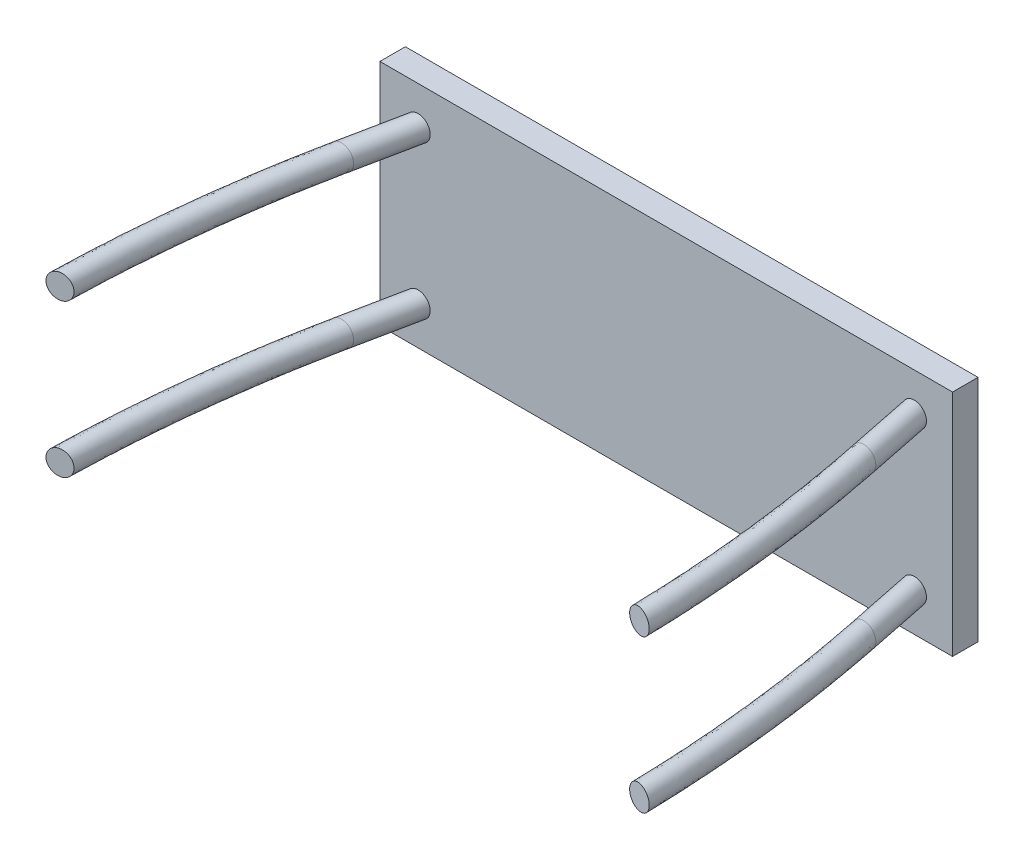
ISO-10303-21;
HEADER;
FILE_DESCRIPTION(('STEP AP214'),'2;1');
FILE_NAME('part.step','',(''),(''),'','','');
FILE_SCHEMA(('AUTOMOTIVE_DESIGN { 1 0 10303 214 1 1 1 1 }'));
ENDSEC;
DATA;
#1=APPLICATION_CONTEXT('core data for automotive mechanical design processes');
#2=APPLICATION_PROTOCOL_DEFINITION('international standard','automotive_design',2000,#1);
#3=PRODUCT_CONTEXT('',#1,'mechanical');
#4=PRODUCT('Part','Part','',(#3));
#5=PRODUCT_RELATED_PRODUCT_CATEGORY('part','',(#4));
#6=PRODUCT_DEFINITION_FORMATION('','',#4);
#7=PRODUCT_DEFINITION_CONTEXT('part definition',#1,'design');
#8=PRODUCT_DEFINITION('design','',#6,#7);
#9=PRODUCT_DEFINITION_SHAPE('','',#8);
#10=(LENGTH_UNIT() NAMED_UNIT(*) SI_UNIT(.MILLI.,.METRE.));
#11=(NAMED_UNIT(*) PLANE_ANGLE_UNIT() SI_UNIT($,.RADIAN.));
#12=(NAMED_UNIT(*) SI_UNIT($,.STERADIAN.) SOLID_ANGLE_UNIT());
#13=UNCERTAINTY_MEASURE_WITH_UNIT(LENGTH_MEASURE(1.E-05),#10,'distance_accuracy_value','');
#14=(GEOMETRIC_REPRESENTATION_CONTEXT(3) GLOBAL_UNCERTAINTY_ASSIGNED_CONTEXT((#13)) GLOBAL_UNIT_ASSIGNED_CONTEXT((#10,
#11,#12)) REPRESENTATION_CONTEXT('',''));
#15=CARTESIAN_POINT('',(0.,0.,0.));
#16=DIRECTION('',(0.,0.,1.));
#17=DIRECTION('',(1.,0.,0.));
#18=AXIS2_PLACEMENT_3D('',#15,#16,#17);
#19=CARTESIAN_POINT('',(0.,0.,50.8));
#20=DIRECTION('',(1.,0.,0.));
#21=DIRECTION('',(0.,0.,-1.));
#22=AXIS2_PLACEMENT_3D('',#19,#20,#21);
#23=PLANE('',#22);
#24=DIRECTION('',(0.,-1.,0.));
#25=VECTOR('',#24,1.);
#26=CARTESIAN_POINT('',(0.,0.,0.));
#27=LINE('',#26,#25);
#28=CARTESIAN_POINT('',(0.,457.2,0.));
#29=VERTEX_POINT('',#28);
#30=CARTESIAN_POINT('',(0.,0.,0.));
#31=VERTEX_POINT('',#30);
#32=EDGE_CURVE('E128',#29,#31,#27,.T.);
#33=ORIENTED_EDGE('',*,*,#32,.T.);
#34=DIRECTION('',(0.,0.,-1.));
#35=VECTOR('',#34,1.);
#36=CARTESIAN_POINT('',(0.,0.,50.8));
#37=LINE('',#36,#35);
#38=CARTESIAN_POINT('',(0.,0.,50.8));
#39=VERTEX_POINT('',#38);
#40=EDGE_CURVE('E11',#39,#31,#37,.T.);
#41=ORIENTED_EDGE('',*,*,#40,.F.);
#42=DIRECTION('',(0.,-1.,0.));
#43=VECTOR('',#42,1.);
#44=CARTESIAN_POINT('',(0.,0.,50.8));
#45=LINE('',#44,#43);
#46=CARTESIAN_POINT('',(0.,457.2,50.8));
#47=VERTEX_POINT('',#46);
#48=EDGE_CURVE('E129',#47,#39,#45,.T.);
#49=ORIENTED_EDGE('',*,*,#48,.F.);
#50=DIRECTION('',(0.,0.,-1.));
#51=VECTOR('',#50,1.);
#52=CARTESIAN_POINT('',(0.,457.2,50.8));
#53=LINE('',#52,#51);
#54=EDGE_CURVE('E135',#47,#29,#53,.T.);
#55=ORIENTED_EDGE('',*,*,#54,.T.);
#56=EDGE_LOOP('',(#33,#41,#49,#55));
#57=FACE_BOUND('',#56,.T.);
#58=ADVANCED_FACE('F33',(#57),#23,.F.);
#59=CARTESIAN_POINT('',(0.,0.,50.8));
#60=DIRECTION('',(0.,1.,0.));
#61=DIRECTION('',(0.,0.,1.));
#62=AXIS2_PLACEMENT_3D('',#59,#60,#61);
#63=PLANE('',#62);
#64=DIRECTION('',(1.,0.,0.));
#65=VECTOR('',#64,1.);
#66=CARTESIAN_POINT('',(0.,0.,0.));
#67=LINE('',#66,#65);
#68=CARTESIAN_POINT('',(1143.,0.,0.));
#69=VERTEX_POINT('',#68);
#70=EDGE_CURVE('E138',#31,#69,#67,.T.);
#71=ORIENTED_EDGE('',*,*,#70,.T.);
#72=DIRECTION('',(0.,0.,-1.));
#73=VECTOR('',#72,1.);
#74=CARTESIAN_POINT('',(1143.,0.,50.8));
#75=LINE('',#74,#73);
#76=CARTESIAN_POINT('',(1143.,0.,50.8));
#77=VERTEX_POINT('',#76);
#78=EDGE_CURVE('E41',#77,#69,#75,.T.);
#79=ORIENTED_EDGE('',*,*,#78,.F.);
#80=DIRECTION('',(1.,0.,0.));
#81=VECTOR('',#80,1.);
#82=CARTESIAN_POINT('',(0.,0.,50.8));
#83=LINE('',#82,#81);
#84=EDGE_CURVE('E80',#39,#77,#83,.T.);
#85=ORIENTED_EDGE('',*,*,#84,.F.);
#86=ORIENTED_EDGE('',*,*,#40,.T.);
#87=EDGE_LOOP('',(#71,#79,#85,#86));
#88=FACE_BOUND('',#87,.T.);
#89=ADVANCED_FACE('F162',(#88),#63,.F.);
#90=CARTESIAN_POINT('',(1143.,0.,50.8));
#91=DIRECTION('',(-1.,0.,0.));
#92=DIRECTION('',(0.,0.,1.));
#93=AXIS2_PLACEMENT_3D('',#90,#91,#92);
#94=PLANE('',#93);
#95=DIRECTION('',(0.,1.,0.));
#96=VECTOR('',#95,1.);
#97=CARTESIAN_POINT('',(1143.,0.,0.));
#98=LINE('',#97,#96);
#99=CARTESIAN_POINT('',(1143.,457.2,0.));
#100=VERTEX_POINT('',#99);
#101=EDGE_CURVE('E67',#69,#100,#98,.T.);
#102=ORIENTED_EDGE('',*,*,#101,.T.);
#103=DIRECTION('',(0.,0.,-1.));
#104=VECTOR('',#103,1.);
#105=CARTESIAN_POINT('',(1143.,457.2,50.8));
#106=LINE('',#105,#104);
#107=CARTESIAN_POINT('',(1143.,457.2,50.8));
#108=VERTEX_POINT('',#107);
#109=EDGE_CURVE('E143',#108,#100,#106,.T.);
#110=ORIENTED_EDGE('',*,*,#109,.F.);
#111=DIRECTION('',(0.,1.,0.));
#112=VECTOR('',#111,1.);
#113=CARTESIAN_POINT('',(1143.,0.,50.8));
#114=LINE('',#113,#112);
#115=EDGE_CURVE('E132',#77,#108,#114,.T.);
#116=ORIENTED_EDGE('',*,*,#115,.F.);
#117=ORIENTED_EDGE('',*,*,#78,.T.);
#118=EDGE_LOOP('',(#102,#110,#116,#117));
#119=FACE_BOUND('',#118,.T.);
#120=ADVANCED_FACE('F145',(#119),#94,.F.);
#121=CARTESIAN_POINT('',(0.,457.2,50.8));
#122=DIRECTION('',(0.,-1.,0.));
#123=DIRECTION('',(0.,0.,-1.));
#124=AXIS2_PLACEMENT_3D('',#121,#122,#123);
#125=PLANE('',#124);
#126=DIRECTION('',(-1.,0.,0.));
#127=VECTOR('',#126,1.);
#128=CARTESIAN_POINT('',(0.,457.2,0.));
#129=LINE('',#128,#127);
#130=EDGE_CURVE('E73',#100,#29,#129,.T.);
#131=ORIENTED_EDGE('',*,*,#130,.T.);
#132=ORIENTED_EDGE('',*,*,#54,.F.);
#133=DIRECTION('',(-1.,0.,0.));
#134=VECTOR('',#133,1.);
#135=CARTESIAN_POINT('',(0.,457.2,50.8));
#136=LINE('',#135,#134);
#137=EDGE_CURVE('E49',#108,#47,#136,.T.);
#138=ORIENTED_EDGE('',*,*,#137,.F.);
#139=ORIENTED_EDGE('',*,*,#109,.T.);
#140=EDGE_LOOP('',(#131,#132,#138,#139));
#141=FACE_BOUND('',#140,.T.);
#142=ADVANCED_FACE('F152',(#141),#125,.F.);
#143=CARTESIAN_POINT('',(0.,0.,50.8));
#144=DIRECTION('',(0.,0.,-1.));
#145=DIRECTION('',(-1.,0.,0.));
#146=AXIS2_PLACEMENT_3D('',#143,#144,#145);
#147=PLANE('',#146);
#148=CARTESIAN_POINT('',(1066.8,76.2,50.8));
#149=DIRECTION('',(0.,0.,1.));
#150=DIRECTION('',(-1.,0.,0.));
#151=AXIS2_PLACEMENT_3D('',#148,#149,#150);
#152=CIRCLE('',#151,24.13);
#153=CARTESIAN_POINT('',(1042.67,76.2,50.8));
#154=VERTEX_POINT('',#153);
#155=EDGE_CURVE('E104',#154,#154,#152,.T.);
#156=ORIENTED_EDGE('',*,*,#155,.F.);
#157=EDGE_LOOP('',(#156));
#158=FACE_BOUND('',#157,.T.);
#159=CARTESIAN_POINT('',(76.2,76.2,50.8));
#160=DIRECTION('',(0.,0.,-1.));
#161=DIRECTION('',(1.,0.,0.));
#162=AXIS2_PLACEMENT_3D('',#159,#160,#161);
#163=CIRCLE('',#162,24.13);
#164=CARTESIAN_POINT('',(100.33,76.2,50.8));
#165=VERTEX_POINT('',#164);
#166=EDGE_CURVE('E97',#165,#165,#163,.F.);
#167=ORIENTED_EDGE('',*,*,#166,.F.);
#168=EDGE_LOOP('',(#167));
#169=FACE_BOUND('',#168,.T.);
#170=CARTESIAN_POINT('',(1066.8,381.,50.8));
#171=DIRECTION('',(0.,0.,-1.));
#172=DIRECTION('',(-1.,0.,0.));
#173=AXIS2_PLACEMENT_3D('',#170,#171,#172);
#174=CIRCLE('',#173,24.13);
#175=CARTESIAN_POINT('',(1042.67,381.,50.8));
#176=VERTEX_POINT('',#175);
#177=EDGE_CURVE('E112',#176,#176,#174,.F.);
#178=ORIENTED_EDGE('',*,*,#177,.F.);
#179=EDGE_LOOP('',(#178));
#180=FACE_BOUND('',#179,.T.);
#181=CARTESIAN_POINT('',(76.2,381.,50.8));
#182=DIRECTION('',(0.,0.,1.));
#183=DIRECTION('',(1.,0.,0.));
#184=AXIS2_PLACEMENT_3D('',#181,#182,#183);
#185=CIRCLE('',#184,24.13);
#186=CARTESIAN_POINT('',(100.33,381.,50.8));
#187=VERTEX_POINT('',#186);
#188=EDGE_CURVE('E120',#187,#187,#185,.T.);
#189=ORIENTED_EDGE('',*,*,#188,.F.);
#190=EDGE_LOOP('',(#189));
#191=FACE_BOUND('',#190,.T.);
#192=ORIENTED_EDGE('',*,*,#48,.T.);
#193=ORIENTED_EDGE('',*,*,#84,.T.);
#194=ORIENTED_EDGE('',*,*,#115,.T.);
#195=ORIENTED_EDGE('',*,*,#137,.T.);
#196=EDGE_LOOP('',(#192,#193,#194,#195));
#197=FACE_BOUND('',#196,.T.);
#198=ADVANCED_FACE('F154',(#158,#169,#180,#191,#197),#147,.F.);
#199=CARTESIAN_POINT('',(0.,0.,0.));
#200=DIRECTION('',(0.,0.,-1.));
#201=DIRECTION('',(-1.,0.,0.));
#202=AXIS2_PLACEMENT_3D('',#199,#200,#201);
#203=PLANE('',#202);
#204=ORIENTED_EDGE('',*,*,#32,.F.);
#205=ORIENTED_EDGE('',*,*,#130,.F.);
#206=ORIENTED_EDGE('',*,*,#101,.F.);
#207=ORIENTED_EDGE('',*,*,#70,.F.);
#208=EDGE_LOOP('',(#204,#205,#206,#207));
#209=FACE_BOUND('',#208,.T.);
#210=ADVANCED_FACE('F148',(#209),#203,.T.);
#211=CARTESIAN_POINT('',(-6.77087771232542,381.,682.584287317516));
#212=DIRECTION('',(0.176309993456529,0.,0.984334692168959));
#213=DIRECTION('',(0.984334692168959,0.,-0.176309993456529));
#214=AXIS2_PLACEMENT_3D('',#211,#212,#213);
#215=PLANE('',#214);
#216=CARTESIAN_POINT('',(-6.77087771232542,381.,682.584287317516));
#217=DIRECTION('',(0.176309993456529,0.,0.984334692168959));
#218=DIRECTION('',(0.984334692168959,0.,-0.176309993456529));
#219=AXIS2_PLACEMENT_3D('',#216,#217,#218);
#220=CIRCLE('',#219,24.13);
#221=CARTESIAN_POINT('',(16.9811184097116,381.,678.32992717541));
#222=VERTEX_POINT('',#221);
#223=EDGE_CURVE('E126',#222,#222,#220,.T.);
#224=ORIENTED_EDGE('',*,*,#223,.T.);
#225=EDGE_LOOP('',(#224));
#226=FACE_BOUND('',#225,.T.);
#227=ADVANCED_FACE('F189',(#226),#215,.T.);
#228=CARTESIAN_POINT('',(100.33,381.,50.8));
#229=CARTESIAN_POINT('',(74.4277062664916,381.,177.8));
#230=CARTESIAN_POINT('',(100.33,429.26,50.8));
#231=CARTESIAN_POINT('',(74.4277062664916,429.26,177.8));
#232=CARTESIAN_POINT('',(52.0700000000001,429.26,50.8));
#233=CARTESIAN_POINT('',(26.1677062664915,429.26,177.8));
#234=CARTESIAN_POINT('',(52.07,381.,50.8));
#235=CARTESIAN_POINT('',(26.1677062664915,381.,177.8));
#236=CARTESIAN_POINT('',(52.07,332.74,50.8));
#237=CARTESIAN_POINT('',(26.1677062664915,332.74,177.8));
#238=CARTESIAN_POINT('',(100.33,332.74,50.8));
#239=CARTESIAN_POINT('',(74.4277062664916,332.74,177.8));
#240=CARTESIAN_POINT('',(100.33,381.,50.8));
#241=CARTESIAN_POINT('',(74.4277062664916,381.,177.8));
#242=(BOUNDED_SURFACE() B_SPLINE_SURFACE(3,1,((#228,#229),(#230,#231),(#232,#233),(#234,#235),
(#236,#237),(#238,#239),(#240,#241)),.UNSPECIFIED.,.T.,.F.,.F.) B_SPLINE_SURFACE_WITH_KNOTS((4,
3,4),(2,2),(0.,0.5,1.),(0.,1.),
.UNSPECIFIED.) GEOMETRIC_REPRESENTATION_ITEM() RATIONAL_B_SPLINE_SURFACE(((1.,1.),
(0.333333333333333,0.333333333333333),(0.333333333333333,0.333333333333333),(1.,1.),
(0.333333333333333,0.333333333333333),(0.333333333333333,0.333333333333333),(1.,1.))) REPRESENTATION_ITEM('') SURFACE());
#243=CARTESIAN_POINT('',(50.2977062664916,381.,177.8));
#244=DIRECTION('',(0.,0.,1.));
#245=DIRECTION('',(1.,0.,0.));
#246=AXIS2_PLACEMENT_3D('',#243,#244,#245);
#247=CIRCLE('',#246,24.13);
#248=CARTESIAN_POINT('',(74.4277062664916,381.,177.8));
#249=VERTEX_POINT('',#248);
#250=EDGE_CURVE('E123',#249,#249,#247,.T.);
#251=CARTESIAN_POINT('',(74.4277062664916,381.,177.8));
#252=CARTESIAN_POINT('',(74.6975218262156,381.,176.477083333333));
#253=CARTESIAN_POINT('',(74.9673373859396,381.,175.154166666667));
#254=CARTESIAN_POINT('',(75.5069685053877,381.,172.508333333333));
#255=CARTESIAN_POINT('',(75.7767840651118,381.,171.185416666667));
#256=CARTESIAN_POINT('',(76.3164151845599,381.,168.539583333333));
#257=CARTESIAN_POINT('',(76.5862307442839,381.,167.216666666667));
#258=CARTESIAN_POINT('',(77.125861863732,381.,164.570833333333));
#259=CARTESIAN_POINT('',(77.3956774234561,381.,163.247916666667));
#260=CARTESIAN_POINT('',(77.9353085429042,381.,160.602083333333));
#261=CARTESIAN_POINT('',(78.2051241026282,381.,159.279166666667));
#262=CARTESIAN_POINT('',(78.7447552220763,381.,156.633333333333));
#263=CARTESIAN_POINT('',(79.0145707818004,381.,155.310416666667));
#264=CARTESIAN_POINT('',(79.5542019012485,381.,152.664583333333));
#265=CARTESIAN_POINT('',(79.8240174609725,381.,151.341666666667));
#266=CARTESIAN_POINT('',(80.3636485804206,381.,148.695833333333));
#267=CARTESIAN_POINT('',(80.6334641401446,381.,147.372916666667));
#268=CARTESIAN_POINT('',(81.1730952595927,381.,144.727083333333));
#269=CARTESIAN_POINT('',(81.4429108193168,381.,143.404166666667));
#270=CARTESIAN_POINT('',(81.9825419387649,381.,140.758333333333));
#271=CARTESIAN_POINT('',(82.2523574984889,381.,139.435416666667));
#272=CARTESIAN_POINT('',(82.791988617937,381.,136.789583333333));
#273=CARTESIAN_POINT('',(83.0618041776611,381.,135.466666666667));
#274=CARTESIAN_POINT('',(83.6014352971092,381.,132.820833333333));
#275=CARTESIAN_POINT('',(83.8712508568332,381.,131.497916666667));
#276=CARTESIAN_POINT('',(84.4108819762813,381.,128.852083333333));
#277=CARTESIAN_POINT('',(84.6806975360053,381.,127.529166666667));
#278=CARTESIAN_POINT('',(85.2203286554534,381.,124.883333333333));
#279=CARTESIAN_POINT('',(85.4901442151775,381.,123.560416666667));
#280=CARTESIAN_POINT('',(86.0297753346256,381.,120.914583333333));
#281=CARTESIAN_POINT('',(86.2995908943496,381.,119.591666666667));
#282=CARTESIAN_POINT('',(86.8392220137977,381.,116.945833333333));
#283=CARTESIAN_POINT('',(87.1090375735218,381.,115.622916666667));
#284=CARTESIAN_POINT('',(87.6486686929699,381.,112.977083333333));
#285=CARTESIAN_POINT('',(87.9184842526939,381.,111.654166666667));
#286=CARTESIAN_POINT('',(88.458115372142,381.,109.008333333333));
#287=CARTESIAN_POINT('',(88.727930931866,381.,107.685416666667));
#288=CARTESIAN_POINT('',(89.2675620513141,381.,105.039583333333));
#289=CARTESIAN_POINT('',(89.5373776110382,381.,103.716666666667));
#290=CARTESIAN_POINT('',(90.0770087304863,381.,101.070833333333));
#291=CARTESIAN_POINT('',(90.3468242902103,381.,99.7479166666667));
#292=CARTESIAN_POINT('',(90.8864554096584,381.,97.1020833333333));
#293=CARTESIAN_POINT('',(91.1562709693825,381.,95.7791666666667));
#294=CARTESIAN_POINT('',(91.6959020888306,381.,93.1333333333333));
#295=CARTESIAN_POINT('',(91.9657176485546,381.,91.8104166666667));
#296=CARTESIAN_POINT('',(92.5053487680027,381.,89.1645833333333));
#297=CARTESIAN_POINT('',(92.7751643277267,381.,87.8416666666667));
#298=CARTESIAN_POINT('',(93.3147954471748,381.,85.1958333333333));
#299=CARTESIAN_POINT('',(93.5846110068989,381.,83.8729166666667));
#300=CARTESIAN_POINT('',(94.124242126347,381.,81.2270833333333));
#301=CARTESIAN_POINT('',(94.394057686071,381.,79.9041666666667));
#302=CARTESIAN_POINT('',(94.9336888055191,381.,77.2583333333333));
#303=CARTESIAN_POINT('',(95.2035043652432,381.,75.9354166666667));
#304=CARTESIAN_POINT('',(95.7431354846913,381.,73.2895833333333));
#305=CARTESIAN_POINT('',(96.0129510444153,381.,71.9666666666667));
#306=CARTESIAN_POINT('',(96.5525821638634,381.,69.3208333333333));
#307=CARTESIAN_POINT('',(96.8223977235874,381.,67.9979166666667));
#308=CARTESIAN_POINT('',(97.3620288430355,381.,65.3520833333333));
#309=CARTESIAN_POINT('',(97.6318444027596,381.,64.0291666666667));
#310=CARTESIAN_POINT('',(98.1714755222077,381.,61.3833333333333));
#311=CARTESIAN_POINT('',(98.4412910819317,381.,60.0604166666667));
#312=CARTESIAN_POINT('',(98.9809222013798,381.,57.4145833333333));
#313=CARTESIAN_POINT('',(99.2507377611039,381.,56.0916666666667));
#314=CARTESIAN_POINT('',(99.790368880552,381.,53.4458333333333));
#315=CARTESIAN_POINT('',(100.060184440276,381.,52.1229166666667));
#316=CARTESIAN_POINT('',(100.33,381.,50.8));
#317=B_SPLINE_CURVE_WITH_KNOTS('',3,(#251,#252,#253,#254,#255,#256,#257,#258,#259,#260,#261,
#262,#263,#264,#265,#266,#267,#268,#269,#270,#271,#272,#273,#274,#275,#276,#277,#278,#279,#280,
#281,#282,#283,#284,#285,#286,#287,#288,#289,#290,#291,#292,#293,#294,#295,#296,#297,#298,#299,
#300,#301,#302,#303,#304,#305,#306,#307,#308,#309,#310,#311,#312,#313,#314,#315,#316),
.UNSPECIFIED.,.F.,.F.,(4,2,2,2,2,2,2,2,2,2,2,2,2,2,2,2,2,2,2,2,2,2,2,2,2,2,2,2,2,2,2,2,4),(0.,
4.05045435586219,8.10090871172432,12.1513630675865,16.2018174234487,20.2522717793108,
24.302726135173,28.3531804910352,32.4036348468973,36.4540892027595,40.5045435586217,
44.5549979144839,48.605452270346,52.6559066262082,56.7063609820704,60.7568153379325,
64.8072696937947,68.8577240496569,72.908178405519,76.9586327613812,81.0090871172434,
85.0595414731055,89.1099958289677,93.1604501848299,97.210904540692,101.261358896554,
105.311813252416,109.362267608279,113.412721964141,117.463176320003,121.513630675865,
125.564085031727,129.614539387589),.UNSPECIFIED.);
#318=EDGE_CURVE('BSEAM198',#249,#187,#317,.T.);
#319=ORIENTED_EDGE('',*,*,#250,.F.);
#320=ORIENTED_EDGE('',*,*,#188,.T.);
#321=ORIENTED_EDGE('',*,*,#318,.T.);
#322=ORIENTED_EDGE('',*,*,#318,.F.);
#323=EDGE_LOOP('',(#319,#321,#320,#322));
#324=FACE_BOUND('',#323,.T.);
#325=ADVANCED_FACE('F198',(#324),#242,.T.);
#326=CARTESIAN_POINT('',(74.427706266492,381.,177.8));
#327=CARTESIAN_POINT('',(40.4992131718742,381.,342.7253410907));
#328=CARTESIAN_POINT('',(21.3001254072414,381.,510.006259926534));
#329=CARTESIAN_POINT('',(16.9811184097111,381.,678.32992717541));
#330=CARTESIAN_POINT('',(74.427706266492,429.26,177.8));
#331=CARTESIAN_POINT('',(40.4992131718742,429.26,342.7253410907));
#332=CARTESIAN_POINT('',(21.3001254072414,429.26,510.006259926534));
#333=CARTESIAN_POINT('',(16.9811184097111,429.26,678.32992717541));
#334=CARTESIAN_POINT('',(26.167706266492,429.26,177.8));
#335=CARTESIAN_POINT('',(-7.76078682812586,429.26,345.580222929852));
#336=CARTESIAN_POINT('',(-26.7072110352127,429.26,515.704820974425));
#337=CARTESIAN_POINT('',(-30.5228738343628,429.26,686.838647459622));
#338=CARTESIAN_POINT('',(26.167706266492,381.,177.8));
#339=CARTESIAN_POINT('',(-7.76078682812587,381.,345.580222929852));
#340=CARTESIAN_POINT('',(-26.7072110352127,381.,515.704820974425));
#341=CARTESIAN_POINT('',(-30.5228738343628,381.,686.838647459622));
#342=CARTESIAN_POINT('',(26.167706266492,332.74,177.8));
#343=CARTESIAN_POINT('',(-7.76078682812587,332.74,345.580222929852));
#344=CARTESIAN_POINT('',(-26.7072110352127,332.74,515.704820974425));
#345=CARTESIAN_POINT('',(-30.5228738343628,332.74,686.838647459622));
#346=CARTESIAN_POINT('',(74.427706266492,332.74,177.8));
#347=CARTESIAN_POINT('',(40.4992131718742,332.74,342.7253410907));
#348=CARTESIAN_POINT('',(21.3001254072414,332.74,510.006259926534));
#349=CARTESIAN_POINT('',(16.9811184097111,332.74,678.32992717541));
#350=CARTESIAN_POINT('',(74.427706266492,381.,177.8));
#351=CARTESIAN_POINT('',(40.4992131718742,381.,342.7253410907));
#352=CARTESIAN_POINT('',(21.3001254072414,381.,510.006259926534));
#353=CARTESIAN_POINT('',(16.9811184097111,381.,678.32992717541));
#354=(BOUNDED_SURFACE() B_SPLINE_SURFACE(3,3,((#326,#327,#328,#329),(#330,#331,#332,#333),(#334,
#335,#336,#337),(#338,#339,#340,#341),(#342,#343,#344,#345),(#346,#347,#348,#349),(#350,#351,
#352,#353)),.UNSPECIFIED.,.T.,.F.,.F.) B_SPLINE_SURFACE_WITH_KNOTS((4,3,4),(4,4),(0.,0.5,1.),
(0.,1.),.UNSPECIFIED.) GEOMETRIC_REPRESENTATION_ITEM() RATIONAL_B_SPLINE_SURFACE(((1.,
0.997383982701614,0.997383982701614,1.),(0.333333333333333,0.332461327567205,0.332461327567205,
0.333333333333333),(0.333333333333333,0.332461327567205,0.332461327567205,0.333333333333333),
(1.,0.997383982701614,0.997383982701614,1.),(0.333333333333333,0.332461327567205,
0.332461327567205,0.333333333333333),(0.333333333333333,0.332461327567205,0.332461327567205,
0.333333333333333),(1.,0.997383982701614,0.997383982701614,1.))) REPRESENTATION_ITEM('') SURFACE());
#355=ORIENTED_EDGE('',*,*,#223,.F.);
#356=EDGE_LOOP('',(#355));
#357=FACE_BOUND('',#356,.T.);
#358=ORIENTED_EDGE('',*,*,#250,.T.);
#359=EDGE_LOOP('',(#358));
#360=FACE_BOUND('',#359,.T.);
#361=ADVANCED_FACE('F190',(#357,#360),#354,.T.);
#362=CARTESIAN_POINT('',(1149.77087771233,381.,682.584287317516));
#363=DIRECTION('',(-0.176309993456529,0.,0.984334692168959));
#364=DIRECTION('',(-0.984334692168959,0.,-0.176309993456529));
#365=AXIS2_PLACEMENT_3D('',#362,#363,#364);
#366=PLANE('',#365);
#367=CARTESIAN_POINT('',(1149.77087771233,381.,682.584287317516));
#368=DIRECTION('',(0.176309993456529,0.,-0.984334692168959));
#369=DIRECTION('',(-0.984334692168959,0.,-0.176309993456529));
#370=AXIS2_PLACEMENT_3D('',#367,#368,#369);
#371=CIRCLE('',#370,24.13);
#372=CARTESIAN_POINT('',(1126.01888159029,381.,678.32992717541));
#373=VERTEX_POINT('',#372);
#374=EDGE_CURVE('E118',#373,#373,#371,.F.);
#375=ORIENTED_EDGE('',*,*,#374,.T.);
#376=EDGE_LOOP('',(#375));
#377=FACE_BOUND('',#376,.T.);
#378=ADVANCED_FACE('F218',(#377),#366,.T.);
#379=CARTESIAN_POINT('',(1042.67,381.,50.8));
#380=CARTESIAN_POINT('',(1068.57229373351,381.,177.8));
#381=CARTESIAN_POINT('',(1042.67,332.74,50.8));
#382=CARTESIAN_POINT('',(1068.57229373351,332.74,177.8));
#383=CARTESIAN_POINT('',(1090.93,332.74,50.8));
#384=CARTESIAN_POINT('',(1116.83229373351,332.74,177.8));
#385=CARTESIAN_POINT('',(1090.93,381.,50.8));
#386=CARTESIAN_POINT('',(1116.83229373351,381.,177.8));
#387=CARTESIAN_POINT('',(1090.93,429.26,50.8));
#388=CARTESIAN_POINT('',(1116.83229373351,429.26,177.8));
#389=CARTESIAN_POINT('',(1042.67,429.26,50.8));
#390=CARTESIAN_POINT('',(1068.57229373351,429.26,177.8));
#391=CARTESIAN_POINT('',(1042.67,381.,50.8));
#392=CARTESIAN_POINT('',(1068.57229373351,381.,177.8));
#393=(BOUNDED_SURFACE() B_SPLINE_SURFACE(3,1,((#379,#380),(#381,#382),(#383,#384),(#385,#386),
(#387,#388),(#389,#390),(#391,#392)),.UNSPECIFIED.,.T.,.F.,.F.) B_SPLINE_SURFACE_WITH_KNOTS((4,
3,4),(2,2),(0.,0.5,1.),(0.,1.),
.UNSPECIFIED.) GEOMETRIC_REPRESENTATION_ITEM() RATIONAL_B_SPLINE_SURFACE(((1.,1.),
(0.333333333333333,0.333333333333333),(0.333333333333333,0.333333333333333),(1.,1.),
(0.333333333333333,0.333333333333333),(0.333333333333333,0.333333333333333),(1.,1.))) REPRESENTATION_ITEM('') SURFACE());
#394=CARTESIAN_POINT('',(1092.70229373351,381.,177.8));
#395=DIRECTION('',(0.,0.,-1.));
#396=DIRECTION('',(-1.,0.,0.));
#397=AXIS2_PLACEMENT_3D('',#394,#395,#396);
#398=CIRCLE('',#397,24.13);
#399=CARTESIAN_POINT('',(1068.57229373351,381.,177.8));
#400=VERTEX_POINT('',#399);
#401=EDGE_CURVE('E115',#400,#400,#398,.F.);
#402=CARTESIAN_POINT('',(1068.57229373351,381.,177.8));
#403=CARTESIAN_POINT('',(1068.30247817378,381.,176.477083333333));
#404=CARTESIAN_POINT('',(1068.03266261406,381.,175.154166666667));
#405=CARTESIAN_POINT('',(1067.49303149461,381.,172.508333333333));
#406=CARTESIAN_POINT('',(1067.22321593489,381.,171.185416666667));
#407=CARTESIAN_POINT('',(1066.68358481544,381.,168.539583333333));
#408=CARTESIAN_POINT('',(1066.41376925572,381.,167.216666666667));
#409=CARTESIAN_POINT('',(1065.87413813627,381.,164.570833333333));
#410=CARTESIAN_POINT('',(1065.60432257654,381.,163.247916666667));
#411=CARTESIAN_POINT('',(1065.0646914571,381.,160.602083333333));
#412=CARTESIAN_POINT('',(1064.79487589737,381.,159.279166666667));
#413=CARTESIAN_POINT('',(1064.25524477792,381.,156.633333333333));
#414=CARTESIAN_POINT('',(1063.9854292182,381.,155.310416666667));
#415=CARTESIAN_POINT('',(1063.44579809875,381.,152.664583333333));
#416=CARTESIAN_POINT('',(1063.17598253903,381.,151.341666666667));
#417=CARTESIAN_POINT('',(1062.63635141958,381.,148.695833333333));
#418=CARTESIAN_POINT('',(1062.36653585986,381.,147.372916666667));
#419=CARTESIAN_POINT('',(1061.82690474041,381.,144.727083333333));
#420=CARTESIAN_POINT('',(1061.55708918068,381.,143.404166666667));
#421=CARTESIAN_POINT('',(1061.01745806124,381.,140.758333333333));
#422=CARTESIAN_POINT('',(1060.74764250151,381.,139.435416666667));
#423=CARTESIAN_POINT('',(1060.20801138206,381.,136.789583333333));
#424=CARTESIAN_POINT('',(1059.93819582234,381.,135.466666666667));
#425=CARTESIAN_POINT('',(1059.39856470289,381.,132.820833333333));
#426=CARTESIAN_POINT('',(1059.12874914317,381.,131.497916666667));
#427=CARTESIAN_POINT('',(1058.58911802372,381.,128.852083333333));
#428=CARTESIAN_POINT('',(1058.31930246399,381.,127.529166666667));
#429=CARTESIAN_POINT('',(1057.77967134455,381.,124.883333333333));
#430=CARTESIAN_POINT('',(1057.50985578482,381.,123.560416666667));
#431=CARTESIAN_POINT('',(1056.97022466537,381.,120.914583333333));
#432=CARTESIAN_POINT('',(1056.70040910565,381.,119.591666666667));
#433=CARTESIAN_POINT('',(1056.1607779862,381.,116.945833333333));
#434=CARTESIAN_POINT('',(1055.89096242648,381.,115.622916666667));
#435=CARTESIAN_POINT('',(1055.35133130703,381.,112.977083333333));
#436=CARTESIAN_POINT('',(1055.08151574731,381.,111.654166666667));
#437=CARTESIAN_POINT('',(1054.54188462786,381.,109.008333333333));
#438=CARTESIAN_POINT('',(1054.27206906813,381.,107.685416666667));
#439=CARTESIAN_POINT('',(1053.73243794869,381.,105.039583333333));
#440=CARTESIAN_POINT('',(1053.46262238896,381.,103.716666666667));
#441=CARTESIAN_POINT('',(1052.92299126951,381.,101.070833333333));
#442=CARTESIAN_POINT('',(1052.65317570979,381.,99.7479166666667));
#443=CARTESIAN_POINT('',(1052.11354459034,381.,97.1020833333333));
#444=CARTESIAN_POINT('',(1051.84372903062,381.,95.7791666666667));
#445=CARTESIAN_POINT('',(1051.30409791117,381.,93.1333333333333));
#446=CARTESIAN_POINT('',(1051.03428235145,381.,91.8104166666667));
#447=CARTESIAN_POINT('',(1050.494651232,381.,89.1645833333333));
#448=CARTESIAN_POINT('',(1050.22483567227,381.,87.8416666666667));
#449=CARTESIAN_POINT('',(1049.68520455283,381.,85.1958333333333));
#450=CARTESIAN_POINT('',(1049.4153889931,381.,83.8729166666667));
#451=CARTESIAN_POINT('',(1048.87575787365,381.,81.2270833333333));
#452=CARTESIAN_POINT('',(1048.60594231393,381.,79.9041666666667));
#453=CARTESIAN_POINT('',(1048.06631119448,381.,77.2583333333333));
#454=CARTESIAN_POINT('',(1047.79649563476,381.,75.9354166666667));
#455=CARTESIAN_POINT('',(1047.25686451531,381.,73.2895833333333));
#456=CARTESIAN_POINT('',(1046.98704895558,381.,71.9666666666667));
#457=CARTESIAN_POINT('',(1046.44741783614,381.,69.3208333333333));
#458=CARTESIAN_POINT('',(1046.17760227641,381.,67.9979166666667));
#459=CARTESIAN_POINT('',(1045.63797115696,381.,65.3520833333333));
#460=CARTESIAN_POINT('',(1045.36815559724,381.,64.0291666666667));
#461=CARTESIAN_POINT('',(1044.82852447779,381.,61.3833333333333));
#462=CARTESIAN_POINT('',(1044.55870891807,381.,60.0604166666667));
#463=CARTESIAN_POINT('',(1044.01907779862,381.,57.4145833333333));
#464=CARTESIAN_POINT('',(1043.7492622389,381.,56.0916666666667));
#465=CARTESIAN_POINT('',(1043.20963111945,381.,53.4458333333333));
#466=CARTESIAN_POINT('',(1042.93981555972,381.,52.1229166666667));
#467=CARTESIAN_POINT('',(1042.67,381.,50.8));
#468=B_SPLINE_CURVE_WITH_KNOTS('',3,(#402,#403,#404,#405,#406,#407,#408,#409,#410,#411,#412,
#413,#414,#415,#416,#417,#418,#419,#420,#421,#422,#423,#424,#425,#426,#427,#428,#429,#430,#431,
#432,#433,#434,#435,#436,#437,#438,#439,#440,#441,#442,#443,#444,#445,#446,#447,#448,#449,#450,
#451,#452,#453,#454,#455,#456,#457,#458,#459,#460,#461,#462,#463,#464,#465,#466,#467),
.UNSPECIFIED.,.F.,.F.,(4,2,2,2,2,2,2,2,2,2,2,2,2,2,2,2,2,2,2,2,2,2,2,2,2,2,2,2,2,2,2,2,4),(0.,
4.05045435586219,8.10090871172433,12.1513630675865,16.2018174234487,20.2522717793108,
24.302726135173,28.3531804910352,32.4036348468973,36.4540892027595,40.5045435586216,
44.5549979144838,48.605452270346,52.6559066262082,56.7063609820703,60.7568153379325,
64.8072696937947,68.8577240496569,72.908178405519,76.9586327613812,81.0090871172434,
85.0595414731056,89.1099958289677,93.1604501848299,97.2109045406921,101.261358896554,
105.311813252416,109.362267608279,113.412721964141,117.463176320003,121.513630675865,
125.564085031727,129.614539387589),.UNSPECIFIED.);
#469=EDGE_CURVE('BSEAM228',#400,#176,#468,.T.);
#470=ORIENTED_EDGE('',*,*,#401,.F.);
#471=ORIENTED_EDGE('',*,*,#177,.T.);
#472=ORIENTED_EDGE('',*,*,#469,.T.);
#473=ORIENTED_EDGE('',*,*,#469,.F.);
#474=EDGE_LOOP('',(#470,#472,#471,#473));
#475=FACE_BOUND('',#474,.T.);
#476=ADVANCED_FACE('F228',(#475),#393,.T.);
#477=CARTESIAN_POINT('',(1068.57229373351,381.,177.8));
#478=CARTESIAN_POINT('',(1102.50078682813,381.,342.7253410907));
#479=CARTESIAN_POINT('',(1121.69987459276,381.,510.006259926534));
#480=CARTESIAN_POINT('',(1126.01888159029,381.,678.32992717541));
#481=CARTESIAN_POINT('',(1068.57229373351,332.74,177.8));
#482=CARTESIAN_POINT('',(1102.50078682813,332.74,342.7253410907));
#483=CARTESIAN_POINT('',(1121.69987459276,332.74,510.006259926534));
#484=CARTESIAN_POINT('',(1126.01888159029,332.74,678.32992717541));
#485=CARTESIAN_POINT('',(1116.83229373351,332.74,177.8));
#486=CARTESIAN_POINT('',(1150.76078682813,332.74,345.580222929852));
#487=CARTESIAN_POINT('',(1169.70721103521,332.74,515.704820974425));
#488=CARTESIAN_POINT('',(1173.52287383436,332.74,686.838647459622));
#489=CARTESIAN_POINT('',(1116.83229373351,381.,177.8));
#490=CARTESIAN_POINT('',(1150.76078682813,381.,345.580222929852));
#491=CARTESIAN_POINT('',(1169.70721103521,381.,515.704820974425));
#492=CARTESIAN_POINT('',(1173.52287383436,381.,686.838647459622));
#493=CARTESIAN_POINT('',(1116.83229373351,429.26,177.8));
#494=CARTESIAN_POINT('',(1150.76078682813,429.26,345.580222929852));
#495=CARTESIAN_POINT('',(1169.70721103521,429.26,515.704820974425));
#496=CARTESIAN_POINT('',(1173.52287383436,429.26,686.838647459622));
#497=CARTESIAN_POINT('',(1068.57229373351,429.26,177.8));
#498=CARTESIAN_POINT('',(1102.50078682813,429.26,342.7253410907));
#499=CARTESIAN_POINT('',(1121.69987459276,429.26,510.006259926534));
#500=CARTESIAN_POINT('',(1126.01888159029,429.26,678.32992717541));
#501=CARTESIAN_POINT('',(1068.57229373351,381.,177.8));
#502=CARTESIAN_POINT('',(1102.50078682813,381.,342.7253410907));
#503=CARTESIAN_POINT('',(1121.69987459276,381.,510.006259926534));
#504=CARTESIAN_POINT('',(1126.01888159029,381.,678.32992717541));
#505=(BOUNDED_SURFACE() B_SPLINE_SURFACE(3,3,((#477,#478,#479,#480),(#481,#482,#483,#484),(#485,
#486,#487,#488),(#489,#490,#491,#492),(#493,#494,#495,#496),(#497,#498,#499,#500),(#501,#502,
#503,#504)),.UNSPECIFIED.,.T.,.F.,.F.) B_SPLINE_SURFACE_WITH_KNOTS((4,3,4),(4,4),(0.,0.5,1.),
(0.,1.),.UNSPECIFIED.) GEOMETRIC_REPRESENTATION_ITEM() RATIONAL_B_SPLINE_SURFACE(((1.,
0.997383982701614,0.997383982701614,1.),(0.333333333333333,0.332461327567205,0.332461327567205,
0.333333333333333),(0.333333333333333,0.332461327567205,0.332461327567205,0.333333333333333),
(1.,0.997383982701614,0.997383982701614,1.),(0.333333333333333,0.332461327567205,
0.332461327567205,0.333333333333333),(0.333333333333333,0.332461327567205,0.332461327567205,
0.333333333333333),(1.,0.997383982701614,0.997383982701614,1.))) REPRESENTATION_ITEM('') SURFACE());
#506=ORIENTED_EDGE('',*,*,#374,.F.);
#507=EDGE_LOOP('',(#506));
#508=FACE_BOUND('',#507,.T.);
#509=ORIENTED_EDGE('',*,*,#401,.T.);
#510=EDGE_LOOP('',(#509));
#511=FACE_BOUND('',#510,.T.);
#512=ADVANCED_FACE('F201',(#508,#511),#505,.T.);
#513=CARTESIAN_POINT('',(-6.77087771232542,76.2,682.584287317516));
#514=DIRECTION('',(0.176309993456529,0.,0.984334692168959));
#515=DIRECTION('',(0.984334692168959,0.,-0.176309993456529));
#516=AXIS2_PLACEMENT_3D('',#513,#514,#515);
#517=PLANE('',#516);
#518=CARTESIAN_POINT('',(-6.77087771232542,76.2,682.584287317516));
#519=DIRECTION('',(-0.176309993456529,0.,-0.984334692168959));
#520=DIRECTION('',(0.984334692168959,0.,-0.176309993456529));
#521=AXIS2_PLACEMENT_3D('',#518,#519,#520);
#522=CIRCLE('',#521,24.13);
#523=CARTESIAN_POINT('',(16.9811184097116,76.2,678.32992717541));
#524=VERTEX_POINT('',#523);
#525=EDGE_CURVE('E110',#524,#524,#522,.F.);
#526=ORIENTED_EDGE('',*,*,#525,.T.);
#527=EDGE_LOOP('',(#526));
#528=FACE_BOUND('',#527,.T.);
#529=ADVANCED_FACE('F248',(#528),#517,.T.);
#530=CARTESIAN_POINT('',(100.33,76.2,50.8));
#531=CARTESIAN_POINT('',(74.4277062664916,76.2,177.8));
#532=CARTESIAN_POINT('',(100.33,124.46,50.8));
#533=CARTESIAN_POINT('',(74.4277062664916,124.46,177.8));
#534=CARTESIAN_POINT('',(52.07,124.46,50.8));
#535=CARTESIAN_POINT('',(26.1677062664915,124.46,177.8));
#536=CARTESIAN_POINT('',(52.07,76.2,50.8));
#537=CARTESIAN_POINT('',(26.1677062664915,76.2,177.8));
#538=CARTESIAN_POINT('',(52.0700000000001,27.94,50.8));
#539=CARTESIAN_POINT('',(26.1677062664915,27.94,177.8));
#540=CARTESIAN_POINT('',(100.33,27.94,50.8));
#541=CARTESIAN_POINT('',(74.4277062664916,27.94,177.8));
#542=CARTESIAN_POINT('',(100.33,76.2,50.8));
#543=CARTESIAN_POINT('',(74.4277062664916,76.2,177.8));
#544=(BOUNDED_SURFACE() B_SPLINE_SURFACE(3,1,((#530,#531),(#532,#533),(#534,#535),(#536,#537),
(#538,#539),(#540,#541),(#542,#543)),.UNSPECIFIED.,.T.,.F.,.F.) B_SPLINE_SURFACE_WITH_KNOTS((4,
3,4),(2,2),(0.,0.5,1.),(0.,1.),
.UNSPECIFIED.) GEOMETRIC_REPRESENTATION_ITEM() RATIONAL_B_SPLINE_SURFACE(((1.,1.),
(0.333333333333333,0.333333333333333),(0.333333333333333,0.333333333333333),(1.,1.),
(0.333333333333333,0.333333333333333),(0.333333333333333,0.333333333333333),(1.,1.))) REPRESENTATION_ITEM('') SURFACE());
#545=CARTESIAN_POINT('',(50.2977062664916,76.2,177.8));
#546=DIRECTION('',(0.,0.,-1.));
#547=DIRECTION('',(1.,0.,0.));
#548=AXIS2_PLACEMENT_3D('',#545,#546,#547);
#549=CIRCLE('',#548,24.13);
#550=CARTESIAN_POINT('',(74.4277062664916,76.2,177.8));
#551=VERTEX_POINT('',#550);
#552=EDGE_CURVE('E101',#551,#551,#549,.F.);
#553=CARTESIAN_POINT('',(74.4277062664916,76.2,177.8));
#554=CARTESIAN_POINT('',(74.6975218262156,76.2,176.477083333333));
#555=CARTESIAN_POINT('',(74.9673373859396,76.2,175.154166666667));
#556=CARTESIAN_POINT('',(75.5069685053877,76.2,172.508333333333));
#557=CARTESIAN_POINT('',(75.7767840651118,76.2,171.185416666667));
#558=CARTESIAN_POINT('',(76.3164151845599,76.2,168.539583333333));
#559=CARTESIAN_POINT('',(76.5862307442839,76.2,167.216666666667));
#560=CARTESIAN_POINT('',(77.125861863732,76.2,164.570833333333));
#561=CARTESIAN_POINT('',(77.3956774234561,76.2,163.247916666667));
#562=CARTESIAN_POINT('',(77.9353085429042,76.2,160.602083333333));
#563=CARTESIAN_POINT('',(78.2051241026282,76.2,159.279166666667));
#564=CARTESIAN_POINT('',(78.7447552220763,76.2,156.633333333333));
#565=CARTESIAN_POINT('',(79.0145707818004,76.2,155.310416666667));
#566=CARTESIAN_POINT('',(79.5542019012485,76.2,152.664583333333));
#567=CARTESIAN_POINT('',(79.8240174609725,76.2,151.341666666667));
#568=CARTESIAN_POINT('',(80.3636485804206,76.2,148.695833333333));
#569=CARTESIAN_POINT('',(80.6334641401446,76.2,147.372916666667));
#570=CARTESIAN_POINT('',(81.1730952595927,76.2,144.727083333333));
#571=CARTESIAN_POINT('',(81.4429108193168,76.2,143.404166666667));
#572=CARTESIAN_POINT('',(81.9825419387649,76.2,140.758333333333));
#573=CARTESIAN_POINT('',(82.2523574984889,76.2,139.435416666667));
#574=CARTESIAN_POINT('',(82.791988617937,76.2,136.789583333333));
#575=CARTESIAN_POINT('',(83.0618041776611,76.2,135.466666666667));
#576=CARTESIAN_POINT('',(83.6014352971092,76.2,132.820833333333));
#577=CARTESIAN_POINT('',(83.8712508568332,76.2,131.497916666667));
#578=CARTESIAN_POINT('',(84.4108819762813,76.2,128.852083333333));
#579=CARTESIAN_POINT('',(84.6806975360053,76.2,127.529166666667));
#580=CARTESIAN_POINT('',(85.2203286554534,76.2,124.883333333333));
#581=CARTESIAN_POINT('',(85.4901442151775,76.2,123.560416666667));
#582=CARTESIAN_POINT('',(86.0297753346256,76.2,120.914583333333));
#583=CARTESIAN_POINT('',(86.2995908943496,76.2,119.591666666667));
#584=CARTESIAN_POINT('',(86.8392220137977,76.2,116.945833333333));
#585=CARTESIAN_POINT('',(87.1090375735218,76.2,115.622916666667));
#586=CARTESIAN_POINT('',(87.6486686929699,76.2,112.977083333333));
#587=CARTESIAN_POINT('',(87.9184842526939,76.2,111.654166666667));
#588=CARTESIAN_POINT('',(88.458115372142,76.2,109.008333333333));
#589=CARTESIAN_POINT('',(88.727930931866,76.2,107.685416666667));
#590=CARTESIAN_POINT('',(89.2675620513141,76.2,105.039583333333));
#591=CARTESIAN_POINT('',(89.5373776110382,76.2,103.716666666667));
#592=CARTESIAN_POINT('',(90.0770087304863,76.2,101.070833333333));
#593=CARTESIAN_POINT('',(90.3468242902103,76.2,99.7479166666667));
#594=CARTESIAN_POINT('',(90.8864554096584,76.2,97.1020833333333));
#595=CARTESIAN_POINT('',(91.1562709693825,76.2,95.7791666666667));
#596=CARTESIAN_POINT('',(91.6959020888306,76.2,93.1333333333333));
#597=CARTESIAN_POINT('',(91.9657176485546,76.2,91.8104166666667));
#598=CARTESIAN_POINT('',(92.5053487680027,76.2,89.1645833333333));
#599=CARTESIAN_POINT('',(92.7751643277267,76.2,87.8416666666667));
#600=CARTESIAN_POINT('',(93.3147954471748,76.2,85.1958333333333));
#601=CARTESIAN_POINT('',(93.5846110068989,76.2,83.8729166666667));
#602=CARTESIAN_POINT('',(94.124242126347,76.2,81.2270833333333));
#603=CARTESIAN_POINT('',(94.394057686071,76.2,79.9041666666667));
#604=CARTESIAN_POINT('',(94.9336888055191,76.2,77.2583333333333));
#605=CARTESIAN_POINT('',(95.2035043652432,76.2,75.9354166666667));
#606=CARTESIAN_POINT('',(95.7431354846913,76.2,73.2895833333333));
#607=CARTESIAN_POINT('',(96.0129510444153,76.2,71.9666666666667));
#608=CARTESIAN_POINT('',(96.5525821638634,76.2,69.3208333333333));
#609=CARTESIAN_POINT('',(96.8223977235874,76.2,67.9979166666667));
#610=CARTESIAN_POINT('',(97.3620288430355,76.2,65.3520833333333));
#611=CARTESIAN_POINT('',(97.6318444027596,76.2,64.0291666666667));
#612=CARTESIAN_POINT('',(98.1714755222077,76.2,61.3833333333333));
#613=CARTESIAN_POINT('',(98.4412910819317,76.2,60.0604166666667));
#614=CARTESIAN_POINT('',(98.9809222013798,76.2,57.4145833333333));
#615=CARTESIAN_POINT('',(99.2507377611039,76.2,56.0916666666667));
#616=CARTESIAN_POINT('',(99.790368880552,76.2,53.4458333333333));
#617=CARTESIAN_POINT('',(100.060184440276,76.2,52.1229166666667));
#618=CARTESIAN_POINT('',(100.33,76.2,50.8));
#619=B_SPLINE_CURVE_WITH_KNOTS('',3,(#553,#554,#555,#556,#557,#558,#559,#560,#561,#562,#563,
#564,#565,#566,#567,#568,#569,#570,#571,#572,#573,#574,#575,#576,#577,#578,#579,#580,#581,#582,
#583,#584,#585,#586,#587,#588,#589,#590,#591,#592,#593,#594,#595,#596,#597,#598,#599,#600,#601,
#602,#603,#604,#605,#606,#607,#608,#609,#610,#611,#612,#613,#614,#615,#616,#617,#618),
.UNSPECIFIED.,.F.,.F.,(4,2,2,2,2,2,2,2,2,2,2,2,2,2,2,2,2,2,2,2,2,2,2,2,2,2,2,2,2,2,2,2,4),(0.,
4.05045435586219,8.10090871172432,12.1513630675865,16.2018174234487,20.2522717793108,
24.302726135173,28.3531804910352,32.4036348468973,36.4540892027595,40.5045435586217,
44.5549979144839,48.605452270346,52.6559066262082,56.7063609820704,60.7568153379325,
64.8072696937947,68.8577240496569,72.908178405519,76.9586327613812,81.0090871172434,
85.0595414731055,89.1099958289677,93.1604501848299,97.210904540692,101.261358896554,
105.311813252416,109.362267608279,113.412721964141,117.463176320003,121.513630675865,
125.564085031727,129.614539387589),.UNSPECIFIED.);
#620=EDGE_CURVE('BSEAM263',#551,#165,#619,.T.);
#621=ORIENTED_EDGE('',*,*,#552,.F.);
#622=ORIENTED_EDGE('',*,*,#166,.T.);
#623=ORIENTED_EDGE('',*,*,#620,.T.);
#624=ORIENTED_EDGE('',*,*,#620,.F.);
#625=EDGE_LOOP('',(#621,#623,#622,#624));
#626=FACE_BOUND('',#625,.T.);
#627=ADVANCED_FACE('F263',(#626),#544,.T.);
#628=CARTESIAN_POINT('',(74.427706266492,76.2,177.8));
#629=CARTESIAN_POINT('',(40.4992131718742,76.2,342.7253410907));
#630=CARTESIAN_POINT('',(21.3001254072414,76.2,510.006259926534));
#631=CARTESIAN_POINT('',(16.9811184097111,76.2,678.32992717541));
#632=CARTESIAN_POINT('',(74.427706266492,124.46,177.8));
#633=CARTESIAN_POINT('',(40.4992131718742,124.46,342.7253410907));
#634=CARTESIAN_POINT('',(21.3001254072414,124.46,510.006259926534));
#635=CARTESIAN_POINT('',(16.9811184097111,124.46,678.32992717541));
#636=CARTESIAN_POINT('',(26.167706266492,124.46,177.8));
#637=CARTESIAN_POINT('',(-7.76078682812587,124.46,345.580222929852));
#638=CARTESIAN_POINT('',(-26.7072110352127,124.46,515.704820974425));
#639=CARTESIAN_POINT('',(-30.5228738343628,124.46,686.838647459622));
#640=CARTESIAN_POINT('',(26.167706266492,76.2,177.8));
#641=CARTESIAN_POINT('',(-7.76078682812587,76.2,345.580222929852));
#642=CARTESIAN_POINT('',(-26.7072110352127,76.2,515.704820974425));
#643=CARTESIAN_POINT('',(-30.5228738343628,76.2,686.838647459622));
#644=CARTESIAN_POINT('',(26.167706266492,27.94,177.8));
#645=CARTESIAN_POINT('',(-7.76078682812586,27.94,345.580222929852));
#646=CARTESIAN_POINT('',(-26.7072110352127,27.94,515.704820974425));
#647=CARTESIAN_POINT('',(-30.5228738343628,27.94,686.838647459622));
#648=CARTESIAN_POINT('',(74.427706266492,27.94,177.8));
#649=CARTESIAN_POINT('',(40.4992131718742,27.94,342.7253410907));
#650=CARTESIAN_POINT('',(21.3001254072414,27.94,510.006259926534));
#651=CARTESIAN_POINT('',(16.9811184097111,27.94,678.32992717541));
#652=CARTESIAN_POINT('',(74.427706266492,76.2,177.8));
#653=CARTESIAN_POINT('',(40.4992131718742,76.2,342.7253410907));
#654=CARTESIAN_POINT('',(21.3001254072414,76.2,510.006259926534));
#655=CARTESIAN_POINT('',(16.9811184097111,76.2,678.32992717541));
#656=(BOUNDED_SURFACE() B_SPLINE_SURFACE(3,3,((#628,#629,#630,#631),(#632,#633,#634,#635),(#636,
#637,#638,#639),(#640,#641,#642,#643),(#644,#645,#646,#647),(#648,#649,#650,#651),(#652,#653,
#654,#655)),.UNSPECIFIED.,.T.,.F.,.F.) B_SPLINE_SURFACE_WITH_KNOTS((4,3,4),(4,4),(0.,0.5,1.),
(0.,1.),.UNSPECIFIED.) GEOMETRIC_REPRESENTATION_ITEM() RATIONAL_B_SPLINE_SURFACE(((1.,
0.997383982701614,0.997383982701614,1.),(0.333333333333333,0.332461327567205,0.332461327567205,
0.333333333333333),(0.333333333333333,0.332461327567205,0.332461327567205,0.333333333333333),
(1.,0.997383982701614,0.997383982701614,1.),(0.333333333333333,0.332461327567205,
0.332461327567205,0.333333333333333),(0.333333333333333,0.332461327567205,0.332461327567205,
0.333333333333333),(1.,0.997383982701614,0.997383982701614,1.))) REPRESENTATION_ITEM('') SURFACE());
#657=ORIENTED_EDGE('',*,*,#525,.F.);
#658=EDGE_LOOP('',(#657));
#659=FACE_BOUND('',#658,.T.);
#660=ORIENTED_EDGE('',*,*,#552,.T.);
#661=EDGE_LOOP('',(#660));
#662=FACE_BOUND('',#661,.T.);
#663=ADVANCED_FACE('F231',(#659,#662),#656,.T.);
#664=CARTESIAN_POINT('',(1149.77087771233,76.2,682.584287317516));
#665=DIRECTION('',(-0.176309993456529,0.,0.984334692168959));
#666=DIRECTION('',(-0.984334692168959,0.,-0.176309993456529));
#667=AXIS2_PLACEMENT_3D('',#664,#665,#666);
#668=PLANE('',#667);
#669=CARTESIAN_POINT('',(1149.77087771233,76.2,682.584287317516));
#670=DIRECTION('',(-0.176309993456529,0.,0.984334692168959));
#671=DIRECTION('',(-0.984334692168959,0.,-0.176309993456529));
#672=AXIS2_PLACEMENT_3D('',#669,#670,#671);
#673=CIRCLE('',#672,24.13);
#674=CARTESIAN_POINT('',(1126.01888159029,76.2,678.32992717541));
#675=VERTEX_POINT('',#674);
#676=EDGE_CURVE('E94',#675,#675,#673,.T.);
#677=ORIENTED_EDGE('',*,*,#676,.T.);
#678=EDGE_LOOP('',(#677));
#679=FACE_BOUND('',#678,.T.);
#680=ADVANCED_FACE('F95',(#679),#668,.T.);
#681=CARTESIAN_POINT('',(1042.67,76.2,50.8));
#682=CARTESIAN_POINT('',(1068.57229373351,76.2,177.8));
#683=CARTESIAN_POINT('',(1042.67,27.94,50.8));
#684=CARTESIAN_POINT('',(1068.57229373351,27.94,177.8));
#685=CARTESIAN_POINT('',(1090.93,27.94,50.8));
#686=CARTESIAN_POINT('',(1116.83229373351,27.94,177.8));
#687=CARTESIAN_POINT('',(1090.93,76.2,50.8));
#688=CARTESIAN_POINT('',(1116.83229373351,76.2,177.8));
#689=CARTESIAN_POINT('',(1090.93,124.46,50.8));
#690=CARTESIAN_POINT('',(1116.83229373351,124.46,177.8));
#691=CARTESIAN_POINT('',(1042.67,124.46,50.8));
#692=CARTESIAN_POINT('',(1068.57229373351,124.46,177.8));
#693=CARTESIAN_POINT('',(1042.67,76.2,50.8));
#694=CARTESIAN_POINT('',(1068.57229373351,76.2,177.8));
#695=(BOUNDED_SURFACE() B_SPLINE_SURFACE(3,1,((#681,#682),(#683,#684),(#685,#686),(#687,#688),
(#689,#690),(#691,#692),(#693,#694)),.UNSPECIFIED.,.T.,.F.,.F.) B_SPLINE_SURFACE_WITH_KNOTS((4,
3,4),(2,2),(0.,0.5,1.),(0.,1.),
.UNSPECIFIED.) GEOMETRIC_REPRESENTATION_ITEM() RATIONAL_B_SPLINE_SURFACE(((1.,1.),
(0.333333333333333,0.333333333333333),(0.333333333333333,0.333333333333333),(1.,1.),
(0.333333333333333,0.333333333333333),(0.333333333333333,0.333333333333333),(1.,1.))) REPRESENTATION_ITEM('') SURFACE());
#696=CARTESIAN_POINT('',(1092.70229373351,76.2,177.8));
#697=DIRECTION('',(0.,0.,1.));
#698=DIRECTION('',(-1.,0.,0.));
#699=AXIS2_PLACEMENT_3D('',#696,#697,#698);
#700=CIRCLE('',#699,24.13);
#701=CARTESIAN_POINT('',(1068.57229373351,76.2,177.8));
#702=VERTEX_POINT('',#701);
#703=EDGE_CURVE('E98',#702,#702,#700,.T.);
#704=CARTESIAN_POINT('',(1068.57229373351,76.2,177.8));
#705=CARTESIAN_POINT('',(1068.30247817378,76.2,176.477083333333));
#706=CARTESIAN_POINT('',(1068.03266261406,76.2,175.154166666667));
#707=CARTESIAN_POINT('',(1067.49303149461,76.2,172.508333333333));
#708=CARTESIAN_POINT('',(1067.22321593489,76.2,171.185416666667));
#709=CARTESIAN_POINT('',(1066.68358481544,76.2,168.539583333333));
#710=CARTESIAN_POINT('',(1066.41376925572,76.2,167.216666666667));
#711=CARTESIAN_POINT('',(1065.87413813627,76.2,164.570833333333));
#712=CARTESIAN_POINT('',(1065.60432257654,76.2,163.247916666667));
#713=CARTESIAN_POINT('',(1065.0646914571,76.2,160.602083333333));
#714=CARTESIAN_POINT('',(1064.79487589737,76.2,159.279166666667));
#715=CARTESIAN_POINT('',(1064.25524477792,76.2,156.633333333333));
#716=CARTESIAN_POINT('',(1063.9854292182,76.2,155.310416666667));
#717=CARTESIAN_POINT('',(1063.44579809875,76.2,152.664583333333));
#718=CARTESIAN_POINT('',(1063.17598253903,76.2,151.341666666667));
#719=CARTESIAN_POINT('',(1062.63635141958,76.2,148.695833333333));
#720=CARTESIAN_POINT('',(1062.36653585986,76.2,147.372916666667));
#721=CARTESIAN_POINT('',(1061.82690474041,76.2,144.727083333333));
#722=CARTESIAN_POINT('',(1061.55708918068,76.2,143.404166666667));
#723=CARTESIAN_POINT('',(1061.01745806124,76.2,140.758333333333));
#724=CARTESIAN_POINT('',(1060.74764250151,76.2,139.435416666667));
#725=CARTESIAN_POINT('',(1060.20801138206,76.2,136.789583333333));
#726=CARTESIAN_POINT('',(1059.93819582234,76.2,135.466666666667));
#727=CARTESIAN_POINT('',(1059.39856470289,76.2,132.820833333333));
#728=CARTESIAN_POINT('',(1059.12874914317,76.2,131.497916666667));
#729=CARTESIAN_POINT('',(1058.58911802372,76.2,128.852083333333));
#730=CARTESIAN_POINT('',(1058.31930246399,76.2,127.529166666667));
#731=CARTESIAN_POINT('',(1057.77967134455,76.2,124.883333333333));
#732=CARTESIAN_POINT('',(1057.50985578482,76.2,123.560416666667));
#733=CARTESIAN_POINT('',(1056.97022466537,76.2,120.914583333333));
#734=CARTESIAN_POINT('',(1056.70040910565,76.2,119.591666666667));
#735=CARTESIAN_POINT('',(1056.1607779862,76.2,116.945833333333));
#736=CARTESIAN_POINT('',(1055.89096242648,76.2,115.622916666667));
#737=CARTESIAN_POINT('',(1055.35133130703,76.2,112.977083333333));
#738=CARTESIAN_POINT('',(1055.08151574731,76.2,111.654166666667));
#739=CARTESIAN_POINT('',(1054.54188462786,76.2,109.008333333333));
#740=CARTESIAN_POINT('',(1054.27206906813,76.2,107.685416666667));
#741=CARTESIAN_POINT('',(1053.73243794869,76.2,105.039583333333));
#742=CARTESIAN_POINT('',(1053.46262238896,76.2,103.716666666667));
#743=CARTESIAN_POINT('',(1052.92299126951,76.2,101.070833333333));
#744=CARTESIAN_POINT('',(1052.65317570979,76.2,99.7479166666667));
#745=CARTESIAN_POINT('',(1052.11354459034,76.2,97.1020833333333));
#746=CARTESIAN_POINT('',(1051.84372903062,76.2,95.7791666666667));
#747=CARTESIAN_POINT('',(1051.30409791117,76.2,93.1333333333333));
#748=CARTESIAN_POINT('',(1051.03428235145,76.2,91.8104166666667));
#749=CARTESIAN_POINT('',(1050.494651232,76.2,89.1645833333333));
#750=CARTESIAN_POINT('',(1050.22483567227,76.2,87.8416666666667));
#751=CARTESIAN_POINT('',(1049.68520455283,76.2,85.1958333333333));
#752=CARTESIAN_POINT('',(1049.4153889931,76.2,83.8729166666667));
#753=CARTESIAN_POINT('',(1048.87575787365,76.2,81.2270833333333));
#754=CARTESIAN_POINT('',(1048.60594231393,76.2,79.9041666666667));
#755=CARTESIAN_POINT('',(1048.06631119448,76.2,77.2583333333333));
#756=CARTESIAN_POINT('',(1047.79649563476,76.2,75.9354166666667));
#757=CARTESIAN_POINT('',(1047.25686451531,76.2,73.2895833333333));
#758=CARTESIAN_POINT('',(1046.98704895558,76.2,71.9666666666667));
#759=CARTESIAN_POINT('',(1046.44741783614,76.2,69.3208333333333));
#760=CARTESIAN_POINT('',(1046.17760227641,76.2,67.9979166666667));
#761=CARTESIAN_POINT('',(1045.63797115696,76.2,65.3520833333333));
#762=CARTESIAN_POINT('',(1045.36815559724,76.2,64.0291666666667));
#763=CARTESIAN_POINT('',(1044.82852447779,76.2,61.3833333333333));
#764=CARTESIAN_POINT('',(1044.55870891807,76.2,60.0604166666667));
#765=CARTESIAN_POINT('',(1044.01907779862,76.2,57.4145833333333));
#766=CARTESIAN_POINT('',(1043.7492622389,76.2,56.0916666666667));
#767=CARTESIAN_POINT('',(1043.20963111945,76.2,53.4458333333333));
#768=CARTESIAN_POINT('',(1042.93981555972,76.2,52.1229166666667));
#769=CARTESIAN_POINT('',(1042.67,76.2,50.8));
#770=B_SPLINE_CURVE_WITH_KNOTS('',3,(#704,#705,#706,#707,#708,#709,#710,#711,#712,#713,#714,
#715,#716,#717,#718,#719,#720,#721,#722,#723,#724,#725,#726,#727,#728,#729,#730,#731,#732,#733,
#734,#735,#736,#737,#738,#739,#740,#741,#742,#743,#744,#745,#746,#747,#748,#749,#750,#751,#752,
#753,#754,#755,#756,#757,#758,#759,#760,#761,#762,#763,#764,#765,#766,#767,#768,#769),
.UNSPECIFIED.,.F.,.F.,(4,2,2,2,2,2,2,2,2,2,2,2,2,2,2,2,2,2,2,2,2,2,2,2,2,2,2,2,2,2,2,2,4),(0.,
4.05045435586219,8.10090871172433,12.1513630675865,16.2018174234487,20.2522717793108,
24.302726135173,28.3531804910352,32.4036348468973,36.4540892027595,40.5045435586216,
44.5549979144838,48.605452270346,52.6559066262082,56.7063609820703,60.7568153379325,
64.8072696937947,68.8577240496569,72.908178405519,76.9586327613812,81.0090871172434,
85.0595414731056,89.1099958289677,93.1604501848299,97.2109045406921,101.261358896554,
105.311813252416,109.362267608279,113.412721964141,117.463176320003,121.513630675865,
125.564085031727,129.614539387589),.UNSPECIFIED.);
#771=EDGE_CURVE('BSEAM292',#702,#154,#770,.T.);
#772=ORIENTED_EDGE('',*,*,#703,.F.);
#773=ORIENTED_EDGE('',*,*,#155,.T.);
#774=ORIENTED_EDGE('',*,*,#771,.T.);
#775=ORIENTED_EDGE('',*,*,#771,.F.);
#776=EDGE_LOOP('',(#772,#774,#773,#775));
#777=FACE_BOUND('',#776,.T.);
#778=ADVANCED_FACE('F292',(#777),#695,.T.);
#779=CARTESIAN_POINT('',(1068.57229373351,76.2,177.8));
#780=CARTESIAN_POINT('',(1102.50078682813,76.2,342.7253410907));
#781=CARTESIAN_POINT('',(1121.69987459276,76.2,510.006259926534));
#782=CARTESIAN_POINT('',(1126.01888159029,76.2,678.32992717541));
#783=CARTESIAN_POINT('',(1068.57229373351,27.94,177.8));
#784=CARTESIAN_POINT('',(1102.50078682813,27.94,342.7253410907));
#785=CARTESIAN_POINT('',(1121.69987459276,27.94,510.006259926534));
#786=CARTESIAN_POINT('',(1126.01888159029,27.94,678.32992717541));
#787=CARTESIAN_POINT('',(1116.83229373351,27.94,177.8));
#788=CARTESIAN_POINT('',(1150.76078682813,27.94,345.580222929852));
#789=CARTESIAN_POINT('',(1169.70721103521,27.94,515.704820974425));
#790=CARTESIAN_POINT('',(1173.52287383436,27.94,686.838647459622));
#791=CARTESIAN_POINT('',(1116.83229373351,76.2,177.8));
#792=CARTESIAN_POINT('',(1150.76078682813,76.2,345.580222929852));
#793=CARTESIAN_POINT('',(1169.70721103521,76.2,515.704820974425));
#794=CARTESIAN_POINT('',(1173.52287383436,76.2,686.838647459622));
#795=CARTESIAN_POINT('',(1116.83229373351,124.46,177.8));
#796=CARTESIAN_POINT('',(1150.76078682813,124.46,345.580222929852));
#797=CARTESIAN_POINT('',(1169.70721103521,124.46,515.704820974425));
#798=CARTESIAN_POINT('',(1173.52287383436,124.46,686.838647459622));
#799=CARTESIAN_POINT('',(1068.57229373351,124.46,177.8));
#800=CARTESIAN_POINT('',(1102.50078682813,124.46,342.7253410907));
#801=CARTESIAN_POINT('',(1121.69987459276,124.46,510.006259926534));
#802=CARTESIAN_POINT('',(1126.01888159029,124.46,678.32992717541));
#803=CARTESIAN_POINT('',(1068.57229373351,76.2,177.8));
#804=CARTESIAN_POINT('',(1102.50078682813,76.2,342.7253410907));
#805=CARTESIAN_POINT('',(1121.69987459276,76.2,510.006259926534));
#806=CARTESIAN_POINT('',(1126.01888159029,76.2,678.32992717541));
#807=(BOUNDED_SURFACE() B_SPLINE_SURFACE(3,3,((#779,#780,#781,#782),(#783,#784,#785,#786),(#787,
#788,#789,#790),(#791,#792,#793,#794),(#795,#796,#797,#798),(#799,#800,#801,#802),(#803,#804,
#805,#806)),.UNSPECIFIED.,.T.,.F.,.F.) B_SPLINE_SURFACE_WITH_KNOTS((4,3,4),(4,4),(0.,0.5,1.),
(0.,1.),.UNSPECIFIED.) GEOMETRIC_REPRESENTATION_ITEM() RATIONAL_B_SPLINE_SURFACE(((1.,
0.997383982701614,0.997383982701614,1.),(0.333333333333333,0.332461327567205,0.332461327567205,
0.333333333333333),(0.333333333333333,0.332461327567205,0.332461327567205,0.333333333333333),
(1.,0.997383982701614,0.997383982701614,1.),(0.333333333333333,0.332461327567205,
0.332461327567205,0.333333333333333),(0.333333333333333,0.332461327567205,0.332461327567205,
0.333333333333333),(1.,0.997383982701614,0.997383982701614,1.))) REPRESENTATION_ITEM('') SURFACE());
#808=ORIENTED_EDGE('',*,*,#676,.F.);
#809=EDGE_LOOP('',(#808));
#810=FACE_BOUND('',#809,.T.);
#811=ORIENTED_EDGE('',*,*,#703,.T.);
#812=EDGE_LOOP('',(#811));
#813=FACE_BOUND('',#812,.T.);
#814=ADVANCED_FACE('F266',(#810,#813),#807,.T.);
#815=CLOSED_SHELL('',(#58,#89,#120,#142,#198,#210,#227,#325,#361,#378,#476,#512,#529,#627,#663,
#680,#778,#814));
#816=MANIFOLD_SOLID_BREP('B2',#815);
#817=ADVANCED_BREP_SHAPE_REPRESENTATION('',(#18,#816),#14);
#818=SHAPE_DEFINITION_REPRESENTATION(#9,#817);
ENDSEC;
END-ISO-10303-21;
